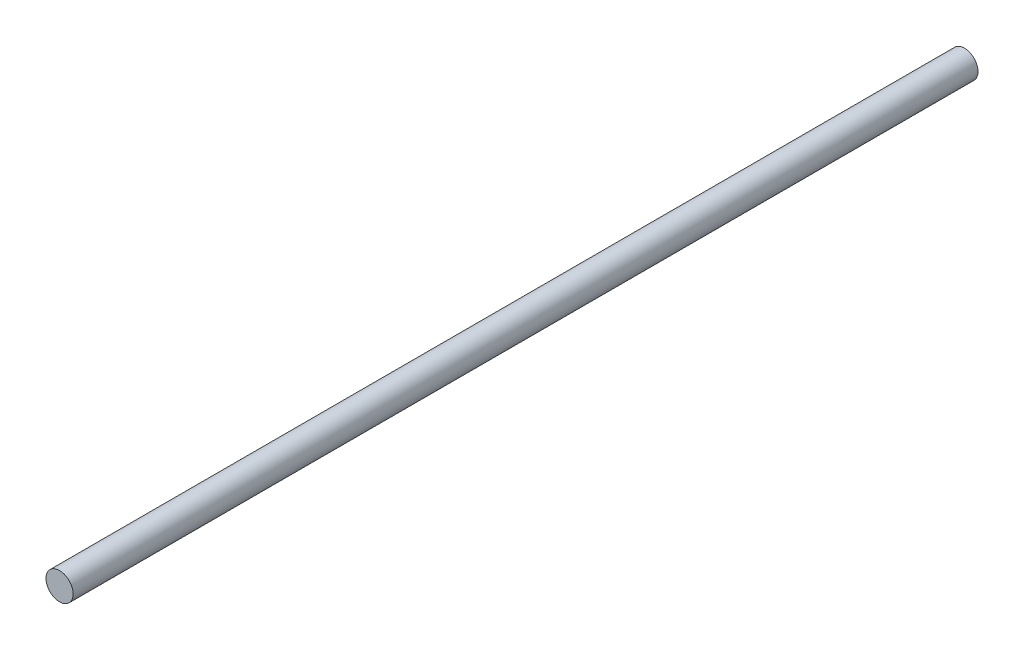
ISO-10303-21;
HEADER;
FILE_DESCRIPTION(('STEP AP214'),'2;1');
FILE_NAME('part.step','',(''),(''),'','','');
FILE_SCHEMA(('AUTOMOTIVE_DESIGN { 1 0 10303 214 1 1 1 1 }'));
ENDSEC;
DATA;
#1=APPLICATION_CONTEXT('core data for automotive mechanical design processes');
#2=APPLICATION_PROTOCOL_DEFINITION('international standard','automotive_design',2000,#1);
#3=PRODUCT_CONTEXT('',#1,'mechanical');
#4=PRODUCT('Part','Part','',(#3));
#5=PRODUCT_RELATED_PRODUCT_CATEGORY('part','',(#4));
#6=PRODUCT_DEFINITION_FORMATION('','',#4);
#7=PRODUCT_DEFINITION_CONTEXT('part definition',#1,'design');
#8=PRODUCT_DEFINITION('design','',#6,#7);
#9=PRODUCT_DEFINITION_SHAPE('','',#8);
#10=(LENGTH_UNIT() NAMED_UNIT(*) SI_UNIT(.MILLI.,.METRE.));
#11=(NAMED_UNIT(*) PLANE_ANGLE_UNIT() SI_UNIT($,.RADIAN.));
#12=(NAMED_UNIT(*) SI_UNIT($,.STERADIAN.) SOLID_ANGLE_UNIT());
#13=UNCERTAINTY_MEASURE_WITH_UNIT(LENGTH_MEASURE(1.E-05),#10,'distance_accuracy_value','');
#14=(GEOMETRIC_REPRESENTATION_CONTEXT(3) GLOBAL_UNCERTAINTY_ASSIGNED_CONTEXT((#13)) GLOBAL_UNIT_ASSIGNED_CONTEXT((#10,
#11,#12)) REPRESENTATION_CONTEXT('',''));
#15=CARTESIAN_POINT('',(0.,0.,0.));
#16=DIRECTION('',(0.,0.,1.));
#17=DIRECTION('',(1.,0.,0.));
#18=AXIS2_PLACEMENT_3D('',#15,#16,#17);
#19=CARTESIAN_POINT('',(0.,0.,200.));
#20=DIRECTION('',(0.,0.,-1.));
#21=DIRECTION('',(-1.,0.,0.));
#22=AXIS2_PLACEMENT_3D('',#19,#20,#21);
#23=CYLINDRICAL_SURFACE('',#22,6.);
#24=CARTESIAN_POINT('',(0.,0.,200.));
#25=DIRECTION('',(0.,0.,1.));
#26=DIRECTION('',(1.,0.,0.));
#27=AXIS2_PLACEMENT_3D('',#24,#25,#26);
#28=CIRCLE('',#27,6.);
#29=CARTESIAN_POINT('',(6.,0.,200.));
#30=VERTEX_POINT('',#29);
#31=EDGE_CURVE('E10',#30,#30,#28,.T.);
#32=ORIENTED_EDGE('',*,*,#31,.F.);
#33=EDGE_LOOP('',(#32));
#34=FACE_BOUND('',#33,.T.);
#35=CARTESIAN_POINT('',(0.,0.,-200.));
#36=DIRECTION('',(0.,0.,1.));
#37=DIRECTION('',(1.,0.,0.));
#38=AXIS2_PLACEMENT_3D('',#35,#36,#37);
#39=CIRCLE('',#38,6.);
#40=CARTESIAN_POINT('',(6.,0.,-200.));
#41=VERTEX_POINT('',#40);
#42=EDGE_CURVE('E36',#41,#41,#39,.T.);
#43=ORIENTED_EDGE('',*,*,#42,.T.);
#44=EDGE_LOOP('',(#43));
#45=FACE_BOUND('',#44,.T.);
#46=ADVANCED_FACE('F33',(#34,#45),#23,.T.);
#47=CARTESIAN_POINT('',(0.,0.,200.));
#48=DIRECTION('',(0.,0.,1.));
#49=DIRECTION('',(1.,0.,0.));
#50=AXIS2_PLACEMENT_3D('',#47,#48,#49);
#51=PLANE('',#50);
#52=ORIENTED_EDGE('',*,*,#31,.T.);
#53=EDGE_LOOP('',(#52));
#54=FACE_BOUND('',#53,.T.);
#55=ADVANCED_FACE('F48',(#54),#51,.T.);
#56=CARTESIAN_POINT('',(0.,0.,-200.));
#57=DIRECTION('',(0.,0.,1.));
#58=DIRECTION('',(1.,0.,0.));
#59=AXIS2_PLACEMENT_3D('',#56,#57,#58);
#60=PLANE('',#59);
#61=ORIENTED_EDGE('',*,*,#42,.F.);
#62=EDGE_LOOP('',(#61));
#63=FACE_BOUND('',#62,.T.);
#64=ADVANCED_FACE('F46',(#63),#60,.F.);
#65=CLOSED_SHELL('',(#46,#55,#64));
#66=MANIFOLD_SOLID_BREP('B2',#65);
#67=ADVANCED_BREP_SHAPE_REPRESENTATION('',(#18,#66),#14);
#68=SHAPE_DEFINITION_REPRESENTATION(#9,#67);
ENDSEC;
END-ISO-10303-21;
